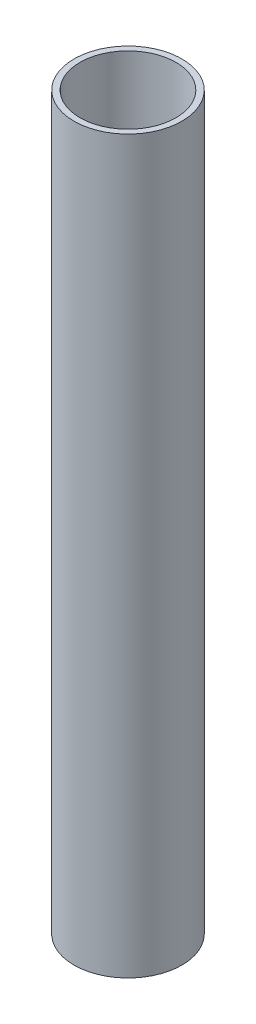
ISO-10303-21;
HEADER;
FILE_DESCRIPTION(('STEP AP214'),'2;1');
FILE_NAME('part.step','',(''),(''),'','','');
FILE_SCHEMA(('AUTOMOTIVE_DESIGN { 1 0 10303 214 1 1 1 1 }'));
ENDSEC;
DATA;
#1=APPLICATION_CONTEXT('core data for automotive mechanical design processes');
#2=APPLICATION_PROTOCOL_DEFINITION('international standard','automotive_design',2000,#1);
#3=PRODUCT_CONTEXT('',#1,'mechanical');
#4=PRODUCT('Part','Part','',(#3));
#5=PRODUCT_RELATED_PRODUCT_CATEGORY('part','',(#4));
#6=PRODUCT_DEFINITION_FORMATION('','',#4);
#7=PRODUCT_DEFINITION_CONTEXT('part definition',#1,'design');
#8=PRODUCT_DEFINITION('design','',#6,#7);
#9=PRODUCT_DEFINITION_SHAPE('','',#8);
#10=(LENGTH_UNIT() NAMED_UNIT(*) SI_UNIT(.MILLI.,.METRE.));
#11=(NAMED_UNIT(*) PLANE_ANGLE_UNIT() SI_UNIT($,.RADIAN.));
#12=(NAMED_UNIT(*) SI_UNIT($,.STERADIAN.) SOLID_ANGLE_UNIT());
#13=UNCERTAINTY_MEASURE_WITH_UNIT(LENGTH_MEASURE(1.E-05),#10,'distance_accuracy_value','');
#14=(GEOMETRIC_REPRESENTATION_CONTEXT(3) GLOBAL_UNCERTAINTY_ASSIGNED_CONTEXT((#13)) GLOBAL_UNIT_ASSIGNED_CONTEXT((#10,
#11,#12)) REPRESENTATION_CONTEXT('',''));
#15=CARTESIAN_POINT('',(0.,0.,0.));
#16=DIRECTION('',(0.,0.,1.));
#17=DIRECTION('',(1.,0.,0.));
#18=AXIS2_PLACEMENT_3D('',#15,#16,#17);
#19=CARTESIAN_POINT('',(0.,203.2,0.));
#20=DIRECTION('',(0.,1.,0.));
#21=DIRECTION('',(0.,0.,1.));
#22=AXIS2_PLACEMENT_3D('',#19,#20,#21);
#23=PLANE('',#22);
#24=CARTESIAN_POINT('',(0.,203.2,0.));
#25=DIRECTION('',(0.,1.,0.));
#26=DIRECTION('',(0.,0.,1.));
#27=AXIS2_PLACEMENT_3D('',#24,#25,#26);
#28=CIRCLE('',#27,15.);
#29=CARTESIAN_POINT('',(0.,203.2,15.));
#30=VERTEX_POINT('',#29);
#31=EDGE_CURVE('E10',#30,#30,#28,.T.);
#32=ORIENTED_EDGE('',*,*,#31,.T.);
#33=EDGE_LOOP('',(#32));
#34=FACE_BOUND('',#33,.T.);
#35=CARTESIAN_POINT('',(0.,203.2,0.));
#36=DIRECTION('',(0.,1.,0.));
#37=DIRECTION('',(0.,0.,1.));
#38=AXIS2_PLACEMENT_3D('',#35,#36,#37);
#39=CIRCLE('',#38,13.349);
#40=CARTESIAN_POINT('',(0.,203.2,13.349));
#41=VERTEX_POINT('',#40);
#42=EDGE_CURVE('E56',#41,#41,#39,.T.);
#43=ORIENTED_EDGE('',*,*,#42,.F.);
#44=EDGE_LOOP('',(#43));
#45=FACE_BOUND('',#44,.T.);
#46=ADVANCED_FACE('F43',(#34,#45),#23,.T.);
#47=CARTESIAN_POINT('',(0.,0.,0.));
#48=DIRECTION('',(0.,1.,0.));
#49=DIRECTION('',(0.,0.,1.));
#50=AXIS2_PLACEMENT_3D('',#47,#48,#49);
#51=PLANE('',#50);
#52=CARTESIAN_POINT('',(0.,0.,0.));
#53=DIRECTION('',(0.,1.,0.));
#54=DIRECTION('',(0.,0.,1.));
#55=AXIS2_PLACEMENT_3D('',#52,#53,#54);
#56=CIRCLE('',#55,15.);
#57=CARTESIAN_POINT('',(0.,0.,15.));
#58=VERTEX_POINT('',#57);
#59=EDGE_CURVE('E47',#58,#58,#56,.T.);
#60=ORIENTED_EDGE('',*,*,#59,.F.);
#61=EDGE_LOOP('',(#60));
#62=FACE_BOUND('',#61,.T.);
#63=CARTESIAN_POINT('',(0.,0.,0.));
#64=DIRECTION('',(0.,1.,0.));
#65=DIRECTION('',(0.,0.,1.));
#66=AXIS2_PLACEMENT_3D('',#63,#64,#65);
#67=CIRCLE('',#66,13.349);
#68=CARTESIAN_POINT('',(0.,0.,13.349));
#69=VERTEX_POINT('',#68);
#70=EDGE_CURVE('E58',#69,#69,#67,.T.);
#71=ORIENTED_EDGE('',*,*,#70,.T.);
#72=EDGE_LOOP('',(#71));
#73=FACE_BOUND('',#72,.T.);
#74=ADVANCED_FACE('F70',(#62,#73),#51,.F.);
#75=CARTESIAN_POINT('',(0.,203.2,0.));
#76=DIRECTION('',(0.,-1.,0.));
#77=DIRECTION('',(0.,0.,-1.));
#78=AXIS2_PLACEMENT_3D('',#75,#76,#77);
#79=CYLINDRICAL_SURFACE('',#78,15.);
#80=ORIENTED_EDGE('',*,*,#31,.F.);
#81=EDGE_LOOP('',(#80));
#82=FACE_BOUND('',#81,.T.);
#83=ORIENTED_EDGE('',*,*,#59,.T.);
#84=EDGE_LOOP('',(#83));
#85=FACE_BOUND('',#84,.T.);
#86=ADVANCED_FACE('F45',(#82,#85),#79,.T.);
#87=CARTESIAN_POINT('',(0.,203.2,0.));
#88=DIRECTION('',(0.,-1.,0.));
#89=DIRECTION('',(0.,0.,-1.));
#90=AXIS2_PLACEMENT_3D('',#87,#88,#89);
#91=CYLINDRICAL_SURFACE('',#90,13.349);
#92=ORIENTED_EDGE('',*,*,#42,.T.);
#93=EDGE_LOOP('',(#92));
#94=FACE_BOUND('',#93,.T.);
#95=ORIENTED_EDGE('',*,*,#70,.F.);
#96=EDGE_LOOP('',(#95));
#97=FACE_BOUND('',#96,.T.);
#98=ADVANCED_FACE('F66',(#94,#97),#91,.F.);
#99=CLOSED_SHELL('',(#46,#74,#86,#98));
#100=MANIFOLD_SOLID_BREP('B2',#99);
#101=ADVANCED_BREP_SHAPE_REPRESENTATION('',(#18,#100),#14);
#102=SHAPE_DEFINITION_REPRESENTATION(#9,#101);
ENDSEC;
END-ISO-10303-21;
